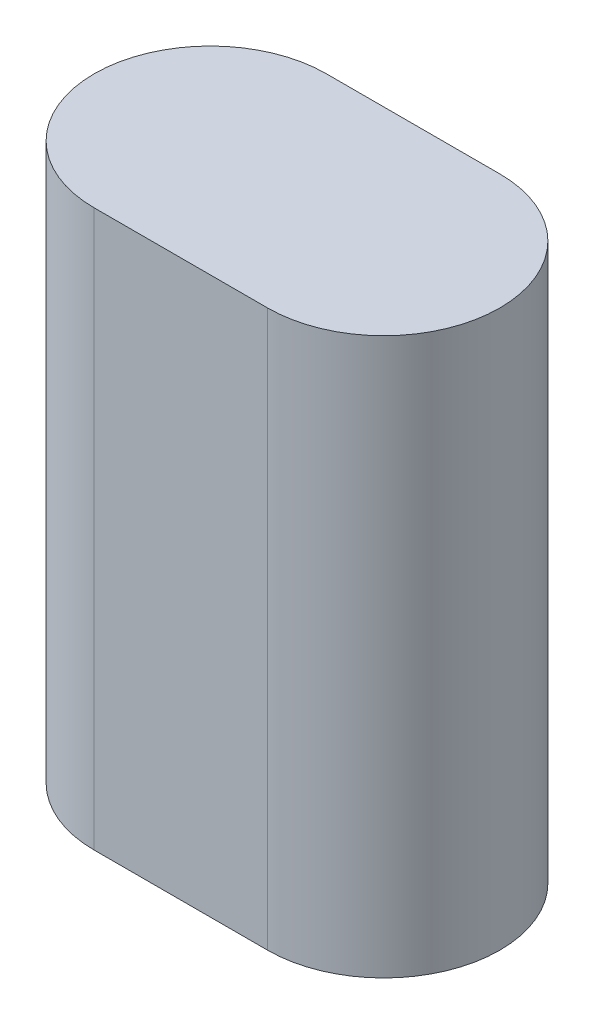
ISO-10303-21;
HEADER;
FILE_DESCRIPTION(('STEP AP214'),'2;1');
FILE_NAME('part.step','',(''),(''),'','','');
FILE_SCHEMA(('AUTOMOTIVE_DESIGN { 1 0 10303 214 1 1 1 1 }'));
ENDSEC;
DATA;
#1=APPLICATION_CONTEXT('core data for automotive mechanical design processes');
#2=APPLICATION_PROTOCOL_DEFINITION('international standard','automotive_design',2000,#1);
#3=PRODUCT_CONTEXT('',#1,'mechanical');
#4=PRODUCT('Part','Part','',(#3));
#5=PRODUCT_RELATED_PRODUCT_CATEGORY('part','',(#4));
#6=PRODUCT_DEFINITION_FORMATION('','',#4);
#7=PRODUCT_DEFINITION_CONTEXT('part definition',#1,'design');
#8=PRODUCT_DEFINITION('design','',#6,#7);
#9=PRODUCT_DEFINITION_SHAPE('','',#8);
#10=(LENGTH_UNIT() NAMED_UNIT(*) SI_UNIT(.MILLI.,.METRE.));
#11=(NAMED_UNIT(*) PLANE_ANGLE_UNIT() SI_UNIT($,.RADIAN.));
#12=(NAMED_UNIT(*) SI_UNIT($,.STERADIAN.) SOLID_ANGLE_UNIT());
#13=UNCERTAINTY_MEASURE_WITH_UNIT(LENGTH_MEASURE(1.E-05),#10,'distance_accuracy_value','');
#14=(GEOMETRIC_REPRESENTATION_CONTEXT(3) GLOBAL_UNCERTAINTY_ASSIGNED_CONTEXT((#13)) GLOBAL_UNIT_ASSIGNED_CONTEXT((#10,
#11,#12)) REPRESENTATION_CONTEXT('',''));
#15=CARTESIAN_POINT('',(0.,0.,0.));
#16=DIRECTION('',(0.,0.,1.));
#17=DIRECTION('',(1.,0.,0.));
#18=AXIS2_PLACEMENT_3D('',#15,#16,#17);
#19=CARTESIAN_POINT('',(-4.77,30.59,0.));
#20=DIRECTION('',(0.,-1.,0.));
#21=DIRECTION('',(0.,0.,-1.));
#22=AXIS2_PLACEMENT_3D('',#19,#20,#21);
#23=CYLINDRICAL_SURFACE('',#22,6.385);
#24=CARTESIAN_POINT('',(-4.77,0.,0.));
#25=DIRECTION('',(0.,1.,0.));
#26=DIRECTION('',(0.,0.,1.));
#27=AXIS2_PLACEMENT_3D('',#24,#25,#26);
#28=CIRCLE('',#27,6.385);
#29=CARTESIAN_POINT('',(-4.77,0.,-6.385));
#30=VERTEX_POINT('',#29);
#31=CARTESIAN_POINT('',(-4.77,0.,6.385));
#32=VERTEX_POINT('',#31);
#33=EDGE_CURVE('E98',#30,#32,#28,.T.);
#34=ORIENTED_EDGE('',*,*,#33,.T.);
#35=DIRECTION('',(0.,-1.,0.));
#36=VECTOR('',#35,1.);
#37=CARTESIAN_POINT('',(-4.77,30.59,6.385));
#38=LINE('',#37,#36);
#39=CARTESIAN_POINT('',(-4.77,30.59,6.385));
#40=VERTEX_POINT('',#39);
#41=EDGE_CURVE('E11',#40,#32,#38,.T.);
#42=ORIENTED_EDGE('',*,*,#41,.F.);
#43=CARTESIAN_POINT('',(-4.77,30.59,0.));
#44=DIRECTION('',(0.,1.,0.));
#45=DIRECTION('',(0.,0.,1.));
#46=AXIS2_PLACEMENT_3D('',#43,#44,#45);
#47=CIRCLE('',#46,6.385);
#48=CARTESIAN_POINT('',(-4.77,30.59,-6.385));
#49=VERTEX_POINT('',#48);
#50=EDGE_CURVE('E86',#49,#40,#47,.T.);
#51=ORIENTED_EDGE('',*,*,#50,.F.);
#52=DIRECTION('',(0.,-1.,0.));
#53=VECTOR('',#52,1.);
#54=CARTESIAN_POINT('',(-4.77,30.59,-6.385));
#55=LINE('',#54,#53);
#56=EDGE_CURVE('E94',#49,#30,#55,.T.);
#57=ORIENTED_EDGE('',*,*,#56,.T.);
#58=EDGE_LOOP('',(#34,#42,#51,#57));
#59=FACE_BOUND('',#58,.T.);
#60=ADVANCED_FACE('F35',(#59),#23,.T.);
#61=CARTESIAN_POINT('',(-4.77,30.59,6.385));
#62=DIRECTION('',(0.,0.,-1.));
#63=DIRECTION('',(-1.,0.,0.));
#64=AXIS2_PLACEMENT_3D('',#61,#62,#63);
#65=PLANE('',#64);
#66=DIRECTION('',(1.,0.,0.));
#67=VECTOR('',#66,1.);
#68=CARTESIAN_POINT('',(-4.77,0.,6.385));
#69=LINE('',#68,#67);
#70=CARTESIAN_POINT('',(4.77,0.,6.38500000000001));
#71=VERTEX_POINT('',#70);
#72=EDGE_CURVE('E90',#32,#71,#69,.T.);
#73=ORIENTED_EDGE('',*,*,#72,.T.);
#74=DIRECTION('',(0.,-1.,0.));
#75=VECTOR('',#74,1.);
#76=CARTESIAN_POINT('',(4.77,30.59,6.38500000000001));
#77=LINE('',#76,#75);
#78=CARTESIAN_POINT('',(4.77,30.59,6.38500000000001));
#79=VERTEX_POINT('',#78);
#80=EDGE_CURVE('E43',#79,#71,#77,.T.);
#81=ORIENTED_EDGE('',*,*,#80,.F.);
#82=DIRECTION('',(1.,0.,0.));
#83=VECTOR('',#82,1.);
#84=CARTESIAN_POINT('',(-4.77,30.59,6.385));
#85=LINE('',#84,#83);
#86=EDGE_CURVE('E81',#40,#79,#85,.T.);
#87=ORIENTED_EDGE('',*,*,#86,.F.);
#88=ORIENTED_EDGE('',*,*,#41,.T.);
#89=EDGE_LOOP('',(#73,#81,#87,#88));
#90=FACE_BOUND('',#89,.T.);
#91=ADVANCED_FACE('F89',(#90),#65,.F.);
#92=CARTESIAN_POINT('',(4.77,30.59,0.));
#93=DIRECTION('',(0.,-1.,0.));
#94=DIRECTION('',(0.,0.,-1.));
#95=AXIS2_PLACEMENT_3D('',#92,#93,#94);
#96=CYLINDRICAL_SURFACE('',#95,6.385);
#97=CARTESIAN_POINT('',(4.77,0.,0.));
#98=DIRECTION('',(0.,1.,0.));
#99=DIRECTION('',(0.,0.,1.));
#100=AXIS2_PLACEMENT_3D('',#97,#98,#99);
#101=CIRCLE('',#100,6.385);
#102=CARTESIAN_POINT('',(4.77,0.,-6.385));
#103=VERTEX_POINT('',#102);
#104=EDGE_CURVE('E68',#71,#103,#101,.T.);
#105=ORIENTED_EDGE('',*,*,#104,.T.);
#106=DIRECTION('',(0.,-1.,0.));
#107=VECTOR('',#106,1.);
#108=CARTESIAN_POINT('',(4.77,30.59,-6.385));
#109=LINE('',#108,#107);
#110=CARTESIAN_POINT('',(4.77,30.59,-6.385));
#111=VERTEX_POINT('',#110);
#112=EDGE_CURVE('E91',#111,#103,#109,.T.);
#113=ORIENTED_EDGE('',*,*,#112,.F.);
#114=CARTESIAN_POINT('',(4.77,30.59,0.));
#115=DIRECTION('',(0.,1.,0.));
#116=DIRECTION('',(0.,0.,1.));
#117=AXIS2_PLACEMENT_3D('',#114,#115,#116);
#118=CIRCLE('',#117,6.385);
#119=EDGE_CURVE('E84',#79,#111,#118,.T.);
#120=ORIENTED_EDGE('',*,*,#119,.F.);
#121=ORIENTED_EDGE('',*,*,#80,.T.);
#122=EDGE_LOOP('',(#105,#113,#120,#121));
#123=FACE_BOUND('',#122,.T.);
#124=ADVANCED_FACE('F92',(#123),#96,.T.);
#125=CARTESIAN_POINT('',(-4.77,30.59,-6.385));
#126=DIRECTION('',(0.,0.,1.));
#127=DIRECTION('',(1.,0.,0.));
#128=AXIS2_PLACEMENT_3D('',#125,#126,#127);
#129=PLANE('',#128);
#130=DIRECTION('',(-1.,0.,0.));
#131=VECTOR('',#130,1.);
#132=CARTESIAN_POINT('',(-4.77,0.,-6.385));
#133=LINE('',#132,#131);
#134=EDGE_CURVE('E74',#103,#30,#133,.T.);
#135=ORIENTED_EDGE('',*,*,#134,.T.);
#136=ORIENTED_EDGE('',*,*,#56,.F.);
#137=DIRECTION('',(-1.,0.,0.));
#138=VECTOR('',#137,1.);
#139=CARTESIAN_POINT('',(-4.77,30.59,-6.385));
#140=LINE('',#139,#138);
#141=EDGE_CURVE('E51',#111,#49,#140,.T.);
#142=ORIENTED_EDGE('',*,*,#141,.F.);
#143=ORIENTED_EDGE('',*,*,#112,.T.);
#144=EDGE_LOOP('',(#135,#136,#142,#143));
#145=FACE_BOUND('',#144,.T.);
#146=ADVANCED_FACE('F105',(#145),#129,.F.);
#147=CARTESIAN_POINT('',(-4.77,30.59,0.));
#148=DIRECTION('',(0.,1.,0.));
#149=DIRECTION('',(0.,0.,1.));
#150=AXIS2_PLACEMENT_3D('',#147,#148,#149);
#151=PLANE('',#150);
#152=ORIENTED_EDGE('',*,*,#50,.T.);
#153=ORIENTED_EDGE('',*,*,#86,.T.);
#154=ORIENTED_EDGE('',*,*,#119,.T.);
#155=ORIENTED_EDGE('',*,*,#141,.T.);
#156=EDGE_LOOP('',(#152,#153,#154,#155));
#157=FACE_BOUND('',#156,.T.);
#158=ADVANCED_FACE('F82',(#157),#151,.T.);
#159=CARTESIAN_POINT('',(-4.77,0.,0.));
#160=DIRECTION('',(0.,1.,0.));
#161=DIRECTION('',(0.,0.,1.));
#162=AXIS2_PLACEMENT_3D('',#159,#160,#161);
#163=PLANE('',#162);
#164=ORIENTED_EDGE('',*,*,#33,.F.);
#165=ORIENTED_EDGE('',*,*,#134,.F.);
#166=ORIENTED_EDGE('',*,*,#104,.F.);
#167=ORIENTED_EDGE('',*,*,#72,.F.);
#168=EDGE_LOOP('',(#164,#165,#166,#167));
#169=FACE_BOUND('',#168,.T.);
#170=ADVANCED_FACE('F108',(#169),#163,.F.);
#171=CLOSED_SHELL('',(#60,#91,#124,#146,#158,#170));
#172=MANIFOLD_SOLID_BREP('B2',#171);
#173=ADVANCED_BREP_SHAPE_REPRESENTATION('',(#18,#172),#14);
#174=SHAPE_DEFINITION_REPRESENTATION(#9,#173);
ENDSEC;
END-ISO-10303-21;
